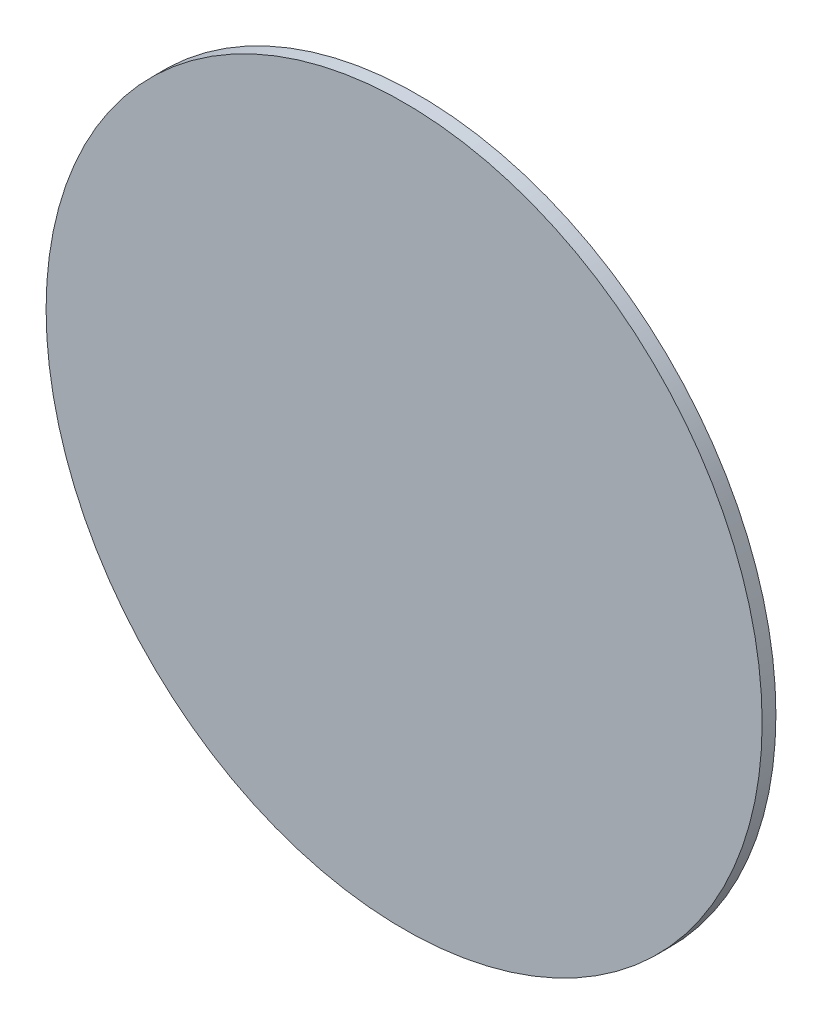
ISO-10303-21;
HEADER;
FILE_DESCRIPTION(('STEP AP214'),'2;1');
FILE_NAME('part.step','',(''),(''),'','','');
FILE_SCHEMA(('AUTOMOTIVE_DESIGN { 1 0 10303 214 1 1 1 1 }'));
ENDSEC;
DATA;
#1=APPLICATION_CONTEXT('core data for automotive mechanical design processes');
#2=APPLICATION_PROTOCOL_DEFINITION('international standard','automotive_design',2000,#1);
#3=PRODUCT_CONTEXT('',#1,'mechanical');
#4=PRODUCT('Part','Part','',(#3));
#5=PRODUCT_RELATED_PRODUCT_CATEGORY('part','',(#4));
#6=PRODUCT_DEFINITION_FORMATION('','',#4);
#7=PRODUCT_DEFINITION_CONTEXT('part definition',#1,'design');
#8=PRODUCT_DEFINITION('design','',#6,#7);
#9=PRODUCT_DEFINITION_SHAPE('','',#8);
#10=(LENGTH_UNIT() NAMED_UNIT(*) SI_UNIT(.MILLI.,.METRE.));
#11=(NAMED_UNIT(*) PLANE_ANGLE_UNIT() SI_UNIT($,.RADIAN.));
#12=(NAMED_UNIT(*) SI_UNIT($,.STERADIAN.) SOLID_ANGLE_UNIT());
#13=UNCERTAINTY_MEASURE_WITH_UNIT(LENGTH_MEASURE(1.E-05),#10,'distance_accuracy_value','');
#14=(GEOMETRIC_REPRESENTATION_CONTEXT(3) GLOBAL_UNCERTAINTY_ASSIGNED_CONTEXT((#13)) GLOBAL_UNIT_ASSIGNED_CONTEXT((#10,
#11,#12)) REPRESENTATION_CONTEXT('',''));
#15=CARTESIAN_POINT('',(0.,0.,0.));
#16=DIRECTION('',(0.,0.,1.));
#17=DIRECTION('',(1.,0.,0.));
#18=AXIS2_PLACEMENT_3D('',#15,#16,#17);
#19=CARTESIAN_POINT('',(0.,0.,-992.777920785913));
#20=DIRECTION('',(0.,0.,1.));
#21=DIRECTION('',(1.,0.,0.));
#22=AXIS2_PLACEMENT_3D('',#19,#20,#21);
#23=CYLINDRICAL_SURFACE('',#22,351.);
#24=CARTESIAN_POINT('',(0.,0.,13.5));
#25=DIRECTION('',(0.,0.,1.));
#26=DIRECTION('',(1.,0.,0.));
#27=AXIS2_PLACEMENT_3D('',#24,#25,#26);
#28=CIRCLE('',#27,351.);
#29=CARTESIAN_POINT('',(351.,0.,13.5));
#30=VERTEX_POINT('',#29);
#31=EDGE_CURVE('E21',#30,#30,#28,.T.);
#32=ORIENTED_EDGE('',*,*,#31,.F.);
#33=EDGE_LOOP('',(#32));
#34=FACE_BOUND('',#33,.T.);
#35=CARTESIAN_POINT('',(0.,0.,0.));
#36=DIRECTION('',(0.,0.,-1.));
#37=DIRECTION('',(-1.,0.,0.));
#38=AXIS2_PLACEMENT_3D('',#35,#36,#37);
#39=CIRCLE('',#38,351.);
#40=CARTESIAN_POINT('',(-351.,0.,0.));
#41=VERTEX_POINT('',#40);
#42=EDGE_CURVE('E10',#41,#41,#39,.F.);
#43=ORIENTED_EDGE('',*,*,#42,.T.);
#44=EDGE_LOOP('',(#43));
#45=FACE_BOUND('',#44,.T.);
#46=ADVANCED_FACE('F14',(#34,#45),#23,.T.);
#47=CARTESIAN_POINT('',(240.,240.,13.5));
#48=DIRECTION('',(0.,0.,-1.));
#49=DIRECTION('',(-1.,0.,0.));
#50=AXIS2_PLACEMENT_3D('',#47,#48,#49);
#51=PLANE('',#50);
#52=ORIENTED_EDGE('',*,*,#31,.T.);
#53=EDGE_LOOP('',(#52));
#54=FACE_BOUND('',#53,.T.);
#55=ADVANCED_FACE('F27',(#54),#51,.F.);
#56=CARTESIAN_POINT('',(240.,240.,0.));
#57=DIRECTION('',(0.,0.,-1.));
#58=DIRECTION('',(-1.,0.,0.));
#59=AXIS2_PLACEMENT_3D('',#56,#57,#58);
#60=PLANE('',#59);
#61=ORIENTED_EDGE('',*,*,#42,.F.);
#62=EDGE_LOOP('',(#61));
#63=FACE_BOUND('',#62,.T.);
#64=ADVANCED_FACE('F16',(#63),#60,.T.);
#65=CLOSED_SHELL('',(#46,#55,#64));
#66=MANIFOLD_SOLID_BREP('B1',#65);
#67=ADVANCED_BREP_SHAPE_REPRESENTATION('',(#18,#66),#14);
#68=SHAPE_DEFINITION_REPRESENTATION(#9,#67);
ENDSEC;
END-ISO-10303-21;
